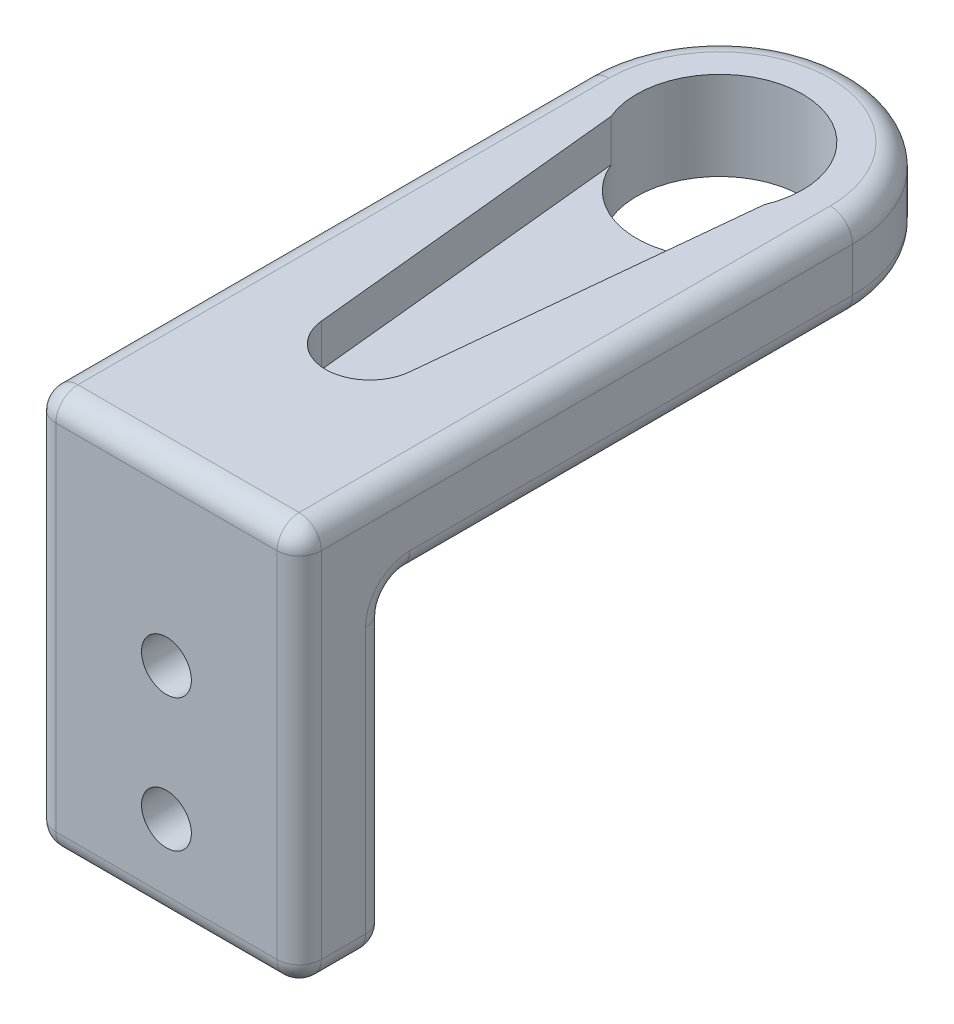
ISO-10303-21;
HEADER;
FILE_DESCRIPTION(('STEP AP214'),'2;1');
FILE_NAME('part.step','',(''),(''),'','','');
FILE_SCHEMA(('AUTOMOTIVE_DESIGN { 1 0 10303 214 1 1 1 1 }'));
ENDSEC;
DATA;
#1=APPLICATION_CONTEXT('core data for automotive mechanical design processes');
#2=APPLICATION_PROTOCOL_DEFINITION('international standard','automotive_design',2000,#1);
#3=PRODUCT_CONTEXT('',#1,'mechanical');
#4=PRODUCT('Part','Part','',(#3));
#5=PRODUCT_RELATED_PRODUCT_CATEGORY('part','',(#4));
#6=PRODUCT_DEFINITION_FORMATION('','',#4);
#7=PRODUCT_DEFINITION_CONTEXT('part definition',#1,'design');
#8=PRODUCT_DEFINITION('design','',#6,#7);
#9=PRODUCT_DEFINITION_SHAPE('','',#8);
#10=(LENGTH_UNIT() NAMED_UNIT(*) SI_UNIT(.MILLI.,.METRE.));
#11=(NAMED_UNIT(*) PLANE_ANGLE_UNIT() SI_UNIT($,.RADIAN.));
#12=(NAMED_UNIT(*) SI_UNIT($,.STERADIAN.) SOLID_ANGLE_UNIT());
#13=UNCERTAINTY_MEASURE_WITH_UNIT(LENGTH_MEASURE(1.E-05),#10,'distance_accuracy_value','');
#14=(GEOMETRIC_REPRESENTATION_CONTEXT(3) GLOBAL_UNCERTAINTY_ASSIGNED_CONTEXT((#13)) GLOBAL_UNIT_ASSIGNED_CONTEXT((#10,
#11,#12)) REPRESENTATION_CONTEXT('',''));
#15=CARTESIAN_POINT('',(0.,0.,0.));
#16=DIRECTION('',(0.,0.,1.));
#17=DIRECTION('',(1.,0.,0.));
#18=AXIS2_PLACEMENT_3D('',#15,#16,#17);
#19=CARTESIAN_POINT('',(0.,4.,0.));
#20=DIRECTION('',(0.,-1.,0.));
#21=DIRECTION('',(0.,0.,-1.));
#22=AXIS2_PLACEMENT_3D('',#19,#20,#21);
#23=CYLINDRICAL_SURFACE('',#22,6.);
#24=DIRECTION('',(0.,-1.,0.));
#25=VECTOR('',#24,1.);
#26=CARTESIAN_POINT('',(-6.,4.,0.));
#27=LINE('',#26,#25);
#28=CARTESIAN_POINT('',(-6.,3.,0.));
#29=VERTEX_POINT('',#28);
#30=CARTESIAN_POINT('',(-6.,1.,0.));
#31=VERTEX_POINT('',#30);
#32=EDGE_CURVE('E234',#29,#31,#27,.T.);
#33=ORIENTED_EDGE('',*,*,#32,.F.);
#34=CARTESIAN_POINT('',(0.,3.,0.));
#35=DIRECTION('',(0.,-1.,0.));
#36=DIRECTION('',(0.,0.,-1.));
#37=AXIS2_PLACEMENT_3D('',#34,#35,#36);
#38=CIRCLE('',#37,6.);
#39=CARTESIAN_POINT('',(6.,3.,0.));
#40=VERTEX_POINT('',#39);
#41=EDGE_CURVE('E306',#29,#40,#38,.T.);
#42=ORIENTED_EDGE('',*,*,#41,.T.);
#43=DIRECTION('',(0.,-1.,0.));
#44=VECTOR('',#43,1.);
#45=CARTESIAN_POINT('',(6.,4.,0.));
#46=LINE('',#45,#44);
#47=CARTESIAN_POINT('',(6.,1.,0.));
#48=VERTEX_POINT('',#47);
#49=EDGE_CURVE('E225',#40,#48,#46,.T.);
#50=ORIENTED_EDGE('',*,*,#49,.T.);
#51=CARTESIAN_POINT('',(0.,1.,0.));
#52=DIRECTION('',(0.,-1.,0.));
#53=DIRECTION('',(0.,0.,-1.));
#54=AXIS2_PLACEMENT_3D('',#51,#52,#53);
#55=CIRCLE('',#54,6.);
#56=EDGE_CURVE('E303',#48,#31,#55,.F.);
#57=ORIENTED_EDGE('',*,*,#56,.T.);
#58=EDGE_LOOP('',(#33,#42,#50,#57));
#59=FACE_BOUND('',#58,.T.);
#60=ADVANCED_FACE('F43',(#59),#23,.T.);
#61=CARTESIAN_POINT('',(-6.,4.,0.));
#62=DIRECTION('',(1.,0.,0.));
#63=DIRECTION('',(0.,0.,-1.));
#64=AXIS2_PLACEMENT_3D('',#61,#62,#63);
#65=PLANE('',#64);
#66=DIRECTION('',(0.,-1.,0.));
#67=VECTOR('',#66,1.);
#68=CARTESIAN_POINT('',(-6.,4.,24.));
#69=LINE('',#68,#67);
#70=CARTESIAN_POINT('',(-6.,-13.,24.));
#71=VERTEX_POINT('',#70);
#72=CARTESIAN_POINT('',(-6.,3.,24.));
#73=VERTEX_POINT('',#72);
#74=EDGE_CURVE('E284',#71,#73,#69,.F.);
#75=ORIENTED_EDGE('',*,*,#74,.T.);
#76=DIRECTION('',(0.,0.,1.));
#77=VECTOR('',#76,1.);
#78=CARTESIAN_POINT('',(-6.,3.,0.));
#79=LINE('',#78,#77);
#80=EDGE_CURVE('E287',#73,#29,#79,.F.);
#81=ORIENTED_EDGE('',*,*,#80,.T.);
#82=ORIENTED_EDGE('',*,*,#32,.T.);
#83=DIRECTION('',(0.,0.,1.));
#84=VECTOR('',#83,1.);
#85=CARTESIAN_POINT('',(-6.,1.,21.));
#86=LINE('',#85,#84);
#87=CARTESIAN_POINT('',(-6.,1.,20.));
#88=VERTEX_POINT('',#87);
#89=EDGE_CURVE('E275',#31,#88,#86,.T.);
#90=ORIENTED_EDGE('',*,*,#89,.T.);
#91=CARTESIAN_POINT('',(-6.,-0.999999999999999,20.));
#92=DIRECTION('',(1.,0.,0.));
#93=DIRECTION('',(0.,0.,-1.));
#94=AXIS2_PLACEMENT_3D('',#91,#92,#93);
#95=CIRCLE('',#94,2.);
#96=CARTESIAN_POINT('',(-6.,-0.999999999999999,22.));
#97=VERTEX_POINT('',#96);
#98=EDGE_CURVE('E271',#97,#88,#95,.F.);
#99=ORIENTED_EDGE('',*,*,#98,.F.);
#100=DIRECTION('',(0.,1.,0.));
#101=VECTOR('',#100,1.);
#102=CARTESIAN_POINT('',(-6.,4.,22.));
#103=LINE('',#102,#101);
#104=CARTESIAN_POINT('',(-6.,-13.,22.));
#105=VERTEX_POINT('',#104);
#106=EDGE_CURVE('E278',#97,#105,#103,.F.);
#107=ORIENTED_EDGE('',*,*,#106,.T.);
#108=DIRECTION('',(0.,0.,-1.));
#109=VECTOR('',#108,1.);
#110=CARTESIAN_POINT('',(-6.,-13.,25.));
#111=LINE('',#110,#109);
#112=EDGE_CURVE('E281',#105,#71,#111,.F.);
#113=ORIENTED_EDGE('',*,*,#112,.T.);
#114=EDGE_LOOP('',(#75,#81,#82,#90,#99,#107,#113));
#115=FACE_BOUND('',#114,.T.);
#116=ADVANCED_FACE('F507',(#115),#65,.F.);
#117=CARTESIAN_POINT('',(-6.,4.,25.));
#118=DIRECTION('',(0.,0.,-1.));
#119=DIRECTION('',(-1.,0.,0.));
#120=AXIS2_PLACEMENT_3D('',#117,#118,#119);
#121=PLANE('',#120);
#122=DIRECTION('',(0.,-1.,0.));
#123=VECTOR('',#122,1.);
#124=CARTESIAN_POINT('',(5.,4.,25.));
#125=LINE('',#124,#123);
#126=CARTESIAN_POINT('',(5.,-13.,25.));
#127=VERTEX_POINT('',#126);
#128=CARTESIAN_POINT('',(5.,3.,25.));
#129=VERTEX_POINT('',#128);
#130=EDGE_CURVE('E328',#127,#129,#125,.F.);
#131=ORIENTED_EDGE('',*,*,#130,.T.);
#132=DIRECTION('',(1.,0.,0.));
#133=VECTOR('',#132,1.);
#134=CARTESIAN_POINT('',(-6.,3.,25.));
#135=LINE('',#134,#133);
#136=CARTESIAN_POINT('',(-5.,3.,25.));
#137=VERTEX_POINT('',#136);
#138=EDGE_CURVE('E331',#129,#137,#135,.F.);
#139=ORIENTED_EDGE('',*,*,#138,.T.);
#140=DIRECTION('',(0.,-1.,0.));
#141=VECTOR('',#140,1.);
#142=CARTESIAN_POINT('',(-5.,4.,25.));
#143=LINE('',#142,#141);
#144=CARTESIAN_POINT('',(-5.,-13.,25.));
#145=VERTEX_POINT('',#144);
#146=EDGE_CURVE('E325',#137,#145,#143,.T.);
#147=ORIENTED_EDGE('',*,*,#146,.T.);
#148=DIRECTION('',(-1.,0.,0.));
#149=VECTOR('',#148,1.);
#150=CARTESIAN_POINT('',(6.,-13.,25.));
#151=LINE('',#150,#149);
#152=EDGE_CURVE('E322',#145,#127,#151,.F.);
#153=ORIENTED_EDGE('',*,*,#152,.T.);
#154=EDGE_LOOP('',(#131,#139,#147,#153));
#155=FACE_BOUND('',#154,.T.);
#156=CARTESIAN_POINT('',(0.,-10.,25.));
#157=DIRECTION('',(0.,0.,-1.));
#158=DIRECTION('',(-1.,0.,0.));
#159=AXIS2_PLACEMENT_3D('',#156,#157,#158);
#160=CIRCLE('',#159,1.125);
#161=CARTESIAN_POINT('',(-1.125,-10.,25.));
#162=VERTEX_POINT('',#161);
#163=EDGE_CURVE('E466',#162,#162,#160,.F.);
#164=ORIENTED_EDGE('',*,*,#163,.F.);
#165=EDGE_LOOP('',(#164));
#166=FACE_BOUND('',#165,.T.);
#167=CARTESIAN_POINT('',(0.,-4.,25.));
#168=DIRECTION('',(0.,0.,-1.));
#169=DIRECTION('',(-1.,0.,0.));
#170=AXIS2_PLACEMENT_3D('',#167,#168,#169);
#171=CIRCLE('',#170,1.125);
#172=CARTESIAN_POINT('',(-1.125,-4.,25.));
#173=VERTEX_POINT('',#172);
#174=EDGE_CURVE('E450',#173,#173,#171,.F.);
#175=ORIENTED_EDGE('',*,*,#174,.F.);
#176=EDGE_LOOP('',(#175));
#177=FACE_BOUND('',#176,.T.);
#178=ADVANCED_FACE('F502',(#155,#166,#177),#121,.F.);
#179=CARTESIAN_POINT('',(6.,4.,25.));
#180=DIRECTION('',(-1.,0.,0.));
#181=DIRECTION('',(0.,0.,1.));
#182=AXIS2_PLACEMENT_3D('',#179,#180,#181);
#183=PLANE('',#182);
#184=CARTESIAN_POINT('',(6.,-0.999999999999999,20.));
#185=DIRECTION('',(-1.,0.,0.));
#186=DIRECTION('',(0.,0.,1.));
#187=AXIS2_PLACEMENT_3D('',#184,#185,#186);
#188=CIRCLE('',#187,2.);
#189=CARTESIAN_POINT('',(6.,1.,20.));
#190=VERTEX_POINT('',#189);
#191=CARTESIAN_POINT('',(6.,-0.999999999999999,22.));
#192=VERTEX_POINT('',#191);
#193=EDGE_CURVE('E251',#190,#192,#188,.F.);
#194=ORIENTED_EDGE('',*,*,#193,.F.);
#195=DIRECTION('',(0.,0.,-1.));
#196=VECTOR('',#195,1.);
#197=CARTESIAN_POINT('',(6.,1.,0.));
#198=LINE('',#197,#196);
#199=EDGE_CURVE('E255',#190,#48,#198,.T.);
#200=ORIENTED_EDGE('',*,*,#199,.T.);
#201=ORIENTED_EDGE('',*,*,#49,.F.);
#202=DIRECTION('',(0.,0.,-1.));
#203=VECTOR('',#202,1.);
#204=CARTESIAN_POINT('',(6.,3.,25.));
#205=LINE('',#204,#203);
#206=CARTESIAN_POINT('',(6.,3.,24.));
#207=VERTEX_POINT('',#206);
#208=EDGE_CURVE('E244',#40,#207,#205,.F.);
#209=ORIENTED_EDGE('',*,*,#208,.T.);
#210=DIRECTION('',(0.,-1.,0.));
#211=VECTOR('',#210,1.);
#212=CARTESIAN_POINT('',(6.,4.,24.));
#213=LINE('',#212,#211);
#214=CARTESIAN_POINT('',(6.,-13.,24.));
#215=VERTEX_POINT('',#214);
#216=EDGE_CURVE('E241',#207,#215,#213,.T.);
#217=ORIENTED_EDGE('',*,*,#216,.T.);
#218=DIRECTION('',(0.,0.,1.));
#219=VECTOR('',#218,1.);
#220=CARTESIAN_POINT('',(6.,-13.,21.));
#221=LINE('',#220,#219);
#222=CARTESIAN_POINT('',(6.,-13.,22.));
#223=VERTEX_POINT('',#222);
#224=EDGE_CURVE('E238',#215,#223,#221,.F.);
#225=ORIENTED_EDGE('',*,*,#224,.T.);
#226=DIRECTION('',(0.,1.,0.));
#227=VECTOR('',#226,1.);
#228=CARTESIAN_POINT('',(6.,4.,22.));
#229=LINE('',#228,#227);
#230=EDGE_CURVE('E247',#223,#192,#229,.T.);
#231=ORIENTED_EDGE('',*,*,#230,.T.);
#232=EDGE_LOOP('',(#194,#200,#201,#209,#217,#225,#231));
#233=FACE_BOUND('',#232,.T.);
#234=ADVANCED_FACE('F492',(#233),#183,.F.);
#235=CARTESIAN_POINT('',(0.,4.,0.));
#236=DIRECTION('',(0.,-1.,0.));
#237=DIRECTION('',(0.,0.,-1.));
#238=AXIS2_PLACEMENT_3D('',#235,#236,#237);
#239=PLANE('',#238);
#240=DIRECTION('',(1.,0.,0.));
#241=VECTOR('',#240,1.);
#242=CARTESIAN_POINT('',(0.,4.,24.));
#243=LINE('',#242,#241);
#244=CARTESIAN_POINT('',(-5.,4.,24.));
#245=VERTEX_POINT('',#244);
#246=CARTESIAN_POINT('',(5.,4.,24.));
#247=VERTEX_POINT('',#246);
#248=EDGE_CURVE('E293',#245,#247,#243,.T.);
#249=ORIENTED_EDGE('',*,*,#248,.T.);
#250=DIRECTION('',(0.,0.,-1.));
#251=VECTOR('',#250,1.);
#252=CARTESIAN_POINT('',(5.,4.,0.));
#253=LINE('',#252,#251);
#254=CARTESIAN_POINT('',(5.,4.,0.));
#255=VERTEX_POINT('',#254);
#256=EDGE_CURVE('E299',#247,#255,#253,.T.);
#257=ORIENTED_EDGE('',*,*,#256,.T.);
#258=CARTESIAN_POINT('',(0.,4.,0.));
#259=DIRECTION('',(0.,-1.,0.));
#260=DIRECTION('',(0.,0.,-1.));
#261=AXIS2_PLACEMENT_3D('',#258,#259,#260);
#262=CIRCLE('',#261,5.);
#263=CARTESIAN_POINT('',(-5.,4.,0.));
#264=VERTEX_POINT('',#263);
#265=EDGE_CURVE('E296',#255,#264,#262,.F.);
#266=ORIENTED_EDGE('',*,*,#265,.T.);
#267=DIRECTION('',(0.,0.,1.));
#268=VECTOR('',#267,1.);
#269=CARTESIAN_POINT('',(-5.,4.,0.));
#270=LINE('',#269,#268);
#271=EDGE_CURVE('E290',#264,#245,#270,.T.);
#272=ORIENTED_EDGE('',*,*,#271,.T.);
#273=EDGE_LOOP('',(#249,#257,#266,#272));
#274=FACE_BOUND('',#273,.T.);
#275=CARTESIAN_POINT('',(0.,4.,0.));
#276=DIRECTION('',(0.,1.,0.));
#277=DIRECTION('',(0.,0.,1.));
#278=AXIS2_PLACEMENT_3D('',#275,#276,#277);
#279=CIRCLE('',#278,3.75);
#280=CARTESIAN_POINT('',(3.45999999999994,4.,1.4459944674861));
#281=VERTEX_POINT('',#280);
#282=CARTESIAN_POINT('',(-3.46,4.,1.44599446748596));
#283=VERTEX_POINT('',#282);
#284=EDGE_CURVE('E213',#281,#283,#279,.T.);
#285=ORIENTED_EDGE('',*,*,#284,.F.);
#286=DIRECTION('',(0.1004588297189,0.,-0.994941216118575));
#287=VECTOR('',#286,1.);
#288=CARTESIAN_POINT('',(3.45999999999994,4.,1.4459944674861));
#289=LINE('',#288,#287);
#290=CARTESIAN_POINT('',(1.98988243223717,4.,16.0059944674861));
#291=VERTEX_POINT('',#290);
#292=EDGE_CURVE('E208',#291,#281,#289,.T.);
#293=ORIENTED_EDGE('',*,*,#292,.F.);
#294=CARTESIAN_POINT('',(0.,4.,15.8050768080483));
#295=DIRECTION('',(0.,1.,0.));
#296=DIRECTION('',(0.,0.,1.));
#297=AXIS2_PLACEMENT_3D('',#294,#295,#296);
#298=CIRCLE('',#297,2.00000000000002);
#299=CARTESIAN_POINT('',(-1.98988243223721,4.,16.005994467486));
#300=VERTEX_POINT('',#299);
#301=EDGE_CURVE('E474',#300,#291,#298,.T.);
#302=ORIENTED_EDGE('',*,*,#301,.F.);
#303=DIRECTION('',(0.100458829718901,0.,0.994941216118575));
#304=VECTOR('',#303,1.);
#305=CARTESIAN_POINT('',(-3.46,4.,1.44599446748596));
#306=LINE('',#305,#304);
#307=EDGE_CURVE('E471',#283,#300,#306,.T.);
#308=ORIENTED_EDGE('',*,*,#307,.F.);
#309=EDGE_LOOP('',(#285,#293,#302,#308));
#310=FACE_BOUND('',#309,.T.);
#311=ADVANCED_FACE('F489',(#274,#310),#239,.F.);
#312=CARTESIAN_POINT('',(0.,0.,0.));
#313=DIRECTION('',(0.,-1.,0.));
#314=DIRECTION('',(0.,0.,-1.));
#315=AXIS2_PLACEMENT_3D('',#312,#313,#314);
#316=PLANE('',#315);
#317=CARTESIAN_POINT('',(0.,0.,0.));
#318=DIRECTION('',(0.,-1.,0.));
#319=DIRECTION('',(0.,0.,-1.));
#320=AXIS2_PLACEMENT_3D('',#317,#318,#319);
#321=CIRCLE('',#320,5.);
#322=CARTESIAN_POINT('',(-5.,0.,0.));
#323=VERTEX_POINT('',#322);
#324=CARTESIAN_POINT('',(5.,0.,0.));
#325=VERTEX_POINT('',#324);
#326=EDGE_CURVE('E315',#323,#325,#321,.T.);
#327=ORIENTED_EDGE('',*,*,#326,.T.);
#328=DIRECTION('',(0.,0.,-1.));
#329=VECTOR('',#328,1.);
#330=CARTESIAN_POINT('',(5.,0.,21.));
#331=LINE('',#330,#329);
#332=CARTESIAN_POINT('',(5.,0.,20.));
#333=VERTEX_POINT('',#332);
#334=EDGE_CURVE('E318',#325,#333,#331,.F.);
#335=ORIENTED_EDGE('',*,*,#334,.T.);
#336=DIRECTION('',(1.,0.,0.));
#337=VECTOR('',#336,1.);
#338=CARTESIAN_POINT('',(0.,0.,20.));
#339=LINE('',#338,#337);
#340=CARTESIAN_POINT('',(-5.,0.,20.));
#341=VERTEX_POINT('',#340);
#342=EDGE_CURVE('E309',#333,#341,#339,.F.);
#343=ORIENTED_EDGE('',*,*,#342,.T.);
#344=DIRECTION('',(0.,0.,1.));
#345=VECTOR('',#344,1.);
#346=CARTESIAN_POINT('',(-5.,0.,0.));
#347=LINE('',#346,#345);
#348=EDGE_CURVE('E312',#341,#323,#347,.F.);
#349=ORIENTED_EDGE('',*,*,#348,.T.);
#350=EDGE_LOOP('',(#327,#335,#343,#349));
#351=FACE_BOUND('',#350,.T.);
#352=CARTESIAN_POINT('',(0.,0.,0.));
#353=DIRECTION('',(0.,-1.,0.));
#354=DIRECTION('',(0.,0.,-1.));
#355=AXIS2_PLACEMENT_3D('',#352,#353,#354);
#356=CIRCLE('',#355,3.75);
#357=CARTESIAN_POINT('',(0.,0.,-3.75));
#358=VERTEX_POINT('',#357);
#359=EDGE_CURVE('E226',#358,#358,#356,.F.);
#360=ORIENTED_EDGE('',*,*,#359,.T.);
#361=EDGE_LOOP('',(#360));
#362=FACE_BOUND('',#361,.T.);
#363=ADVANCED_FACE('F491',(#351,#362),#316,.T.);
#364=CARTESIAN_POINT('',(0.,-0.00100000000000013,0.));
#365=DIRECTION('',(0.,1.,0.));
#366=DIRECTION('',(0.,0.,1.));
#367=AXIS2_PLACEMENT_3D('',#364,#365,#366);
#368=CYLINDRICAL_SURFACE('',#367,3.75);
#369=ORIENTED_EDGE('',*,*,#359,.F.);
#370=EDGE_LOOP('',(#369));
#371=FACE_BOUND('',#370,.T.);
#372=CARTESIAN_POINT('',(0.,2.1,0.));
#373=DIRECTION('',(0.,-1.,0.));
#374=DIRECTION('',(0.,0.,1.));
#375=AXIS2_PLACEMENT_3D('',#372,#373,#374);
#376=CIRCLE('',#375,3.75);
#377=CARTESIAN_POINT('',(3.45999999999994,2.1,1.4459944674861));
#378=VERTEX_POINT('',#377);
#379=CARTESIAN_POINT('',(-3.46,2.1,1.44599446748596));
#380=VERTEX_POINT('',#379);
#381=EDGE_CURVE('E198',#378,#380,#376,.T.);
#382=ORIENTED_EDGE('',*,*,#381,.F.);
#383=DIRECTION('',(0.,1.,0.));
#384=VECTOR('',#383,1.);
#385=CARTESIAN_POINT('',(3.45999999999994,2.1,1.4459944674861));
#386=LINE('',#385,#384);
#387=EDGE_CURVE('E230',#378,#281,#386,.T.);
#388=ORIENTED_EDGE('',*,*,#387,.T.);
#389=ORIENTED_EDGE('',*,*,#284,.T.);
#390=DIRECTION('',(0.,1.,0.));
#391=VECTOR('',#390,1.);
#392=CARTESIAN_POINT('',(-3.46,2.1,1.44599446748596));
#393=LINE('',#392,#391);
#394=EDGE_CURVE('E190',#380,#283,#393,.T.);
#395=ORIENTED_EDGE('',*,*,#394,.F.);
#396=EDGE_LOOP('',(#382,#388,#389,#395));
#397=FACE_BOUND('',#396,.T.);
#398=ADVANCED_FACE('F211',(#371,#397),#368,.F.);
#399=CARTESIAN_POINT('',(3.45999999999994,2.1,1.4459944674861));
#400=DIRECTION('',(0.994941216118575,0.,0.1004588297189));
#401=DIRECTION('',(0.1004588297189,0.,-0.994941216118575));
#402=AXIS2_PLACEMENT_3D('',#399,#400,#401);
#403=PLANE('',#402);
#404=ORIENTED_EDGE('',*,*,#292,.T.);
#405=ORIENTED_EDGE('',*,*,#387,.F.);
#406=DIRECTION('',(0.1004588297189,0.,-0.994941216118575));
#407=VECTOR('',#406,1.);
#408=CARTESIAN_POINT('',(3.45999999999994,2.1,1.4459944674861));
#409=LINE('',#408,#407);
#410=CARTESIAN_POINT('',(1.98988243223717,2.1,16.0059944674861));
#411=VERTEX_POINT('',#410);
#412=EDGE_CURVE('E203',#411,#378,#409,.T.);
#413=ORIENTED_EDGE('',*,*,#412,.F.);
#414=DIRECTION('',(0.,1.,0.));
#415=VECTOR('',#414,1.);
#416=CARTESIAN_POINT('',(1.98988243223717,2.1,16.0059944674861));
#417=LINE('',#416,#415);
#418=EDGE_CURVE('E218',#411,#291,#417,.T.);
#419=ORIENTED_EDGE('',*,*,#418,.T.);
#420=EDGE_LOOP('',(#404,#405,#413,#419));
#421=FACE_BOUND('',#420,.T.);
#422=ADVANCED_FACE('F483',(#421),#403,.F.);
#423=CARTESIAN_POINT('',(0.,2.1,15.8050768080483));
#424=DIRECTION('',(0.,1.,0.));
#425=DIRECTION('',(0.,0.,1.));
#426=AXIS2_PLACEMENT_3D('',#423,#424,#425);
#427=CYLINDRICAL_SURFACE('',#426,2.00000000000002);
#428=ORIENTED_EDGE('',*,*,#301,.T.);
#429=ORIENTED_EDGE('',*,*,#418,.F.);
#430=CARTESIAN_POINT('',(0.,2.1,15.8050768080483));
#431=DIRECTION('',(0.,1.,0.));
#432=DIRECTION('',(0.,0.,1.));
#433=AXIS2_PLACEMENT_3D('',#430,#431,#432);
#434=CIRCLE('',#433,2.00000000000002);
#435=CARTESIAN_POINT('',(-1.98988243223721,2.1,16.005994467486));
#436=VERTEX_POINT('',#435);
#437=EDGE_CURVE('E197',#436,#411,#434,.T.);
#438=ORIENTED_EDGE('',*,*,#437,.F.);
#439=DIRECTION('',(0.,1.,0.));
#440=VECTOR('',#439,1.);
#441=CARTESIAN_POINT('',(-1.98988243223721,2.1,16.005994467486));
#442=LINE('',#441,#440);
#443=EDGE_CURVE('E192',#436,#300,#442,.T.);
#444=ORIENTED_EDGE('',*,*,#443,.T.);
#445=EDGE_LOOP('',(#428,#429,#438,#444));
#446=FACE_BOUND('',#445,.T.);
#447=ADVANCED_FACE('F487',(#446),#427,.F.);
#448=CARTESIAN_POINT('',(-3.46,2.1,1.44599446748596));
#449=DIRECTION('',(-0.994941216118575,0.,0.100458829718901));
#450=DIRECTION('',(0.100458829718901,0.,0.994941216118575));
#451=AXIS2_PLACEMENT_3D('',#448,#449,#450);
#452=PLANE('',#451);
#453=ORIENTED_EDGE('',*,*,#307,.T.);
#454=ORIENTED_EDGE('',*,*,#443,.F.);
#455=DIRECTION('',(0.100458829718901,0.,0.994941216118575));
#456=VECTOR('',#455,1.);
#457=CARTESIAN_POINT('',(-3.46,2.1,1.44599446748596));
#458=LINE('',#457,#456);
#459=EDGE_CURVE('E185',#380,#436,#458,.T.);
#460=ORIENTED_EDGE('',*,*,#459,.F.);
#461=ORIENTED_EDGE('',*,*,#394,.T.);
#462=EDGE_LOOP('',(#453,#454,#460,#461));
#463=FACE_BOUND('',#462,.T.);
#464=ADVANCED_FACE('F188',(#463),#452,.F.);
#465=CARTESIAN_POINT('',(0.,2.1,0.));
#466=DIRECTION('',(0.,1.,0.));
#467=DIRECTION('',(0.,0.,1.));
#468=AXIS2_PLACEMENT_3D('',#465,#466,#467);
#469=PLANE('',#468);
#470=ORIENTED_EDGE('',*,*,#381,.T.);
#471=ORIENTED_EDGE('',*,*,#459,.T.);
#472=ORIENTED_EDGE('',*,*,#437,.T.);
#473=ORIENTED_EDGE('',*,*,#412,.T.);
#474=EDGE_LOOP('',(#470,#471,#472,#473));
#475=FACE_BOUND('',#474,.T.);
#476=ADVANCED_FACE('F201',(#475),#469,.T.);
#477=CARTESIAN_POINT('',(-5.99999999999999,-14.,21.));
#478=DIRECTION('',(0.,0.,1.));
#479=DIRECTION('',(1.,0.,0.));
#480=AXIS2_PLACEMENT_3D('',#477,#478,#479);
#481=PLANE('',#480);
#482=DIRECTION('',(0.,1.,0.));
#483=VECTOR('',#482,1.);
#484=CARTESIAN_POINT('',(5.,-14.,21.));
#485=LINE('',#484,#483);
#486=CARTESIAN_POINT('',(5.,-0.999999999999999,21.));
#487=VERTEX_POINT('',#486);
#488=CARTESIAN_POINT('',(5.,-13.,21.));
#489=VERTEX_POINT('',#488);
#490=EDGE_CURVE('E264',#487,#489,#485,.F.);
#491=ORIENTED_EDGE('',*,*,#490,.T.);
#492=DIRECTION('',(1.,0.,0.));
#493=VECTOR('',#492,1.);
#494=CARTESIAN_POINT('',(-5.99999999999999,-13.,21.));
#495=LINE('',#494,#493);
#496=CARTESIAN_POINT('',(-5.,-13.,21.));
#497=VERTEX_POINT('',#496);
#498=EDGE_CURVE('E268',#489,#497,#495,.F.);
#499=ORIENTED_EDGE('',*,*,#498,.T.);
#500=DIRECTION('',(0.,1.,0.));
#501=VECTOR('',#500,1.);
#502=CARTESIAN_POINT('',(-5.,-14.,21.));
#503=LINE('',#502,#501);
#504=CARTESIAN_POINT('',(-5.,-0.999999999999999,21.));
#505=VERTEX_POINT('',#504);
#506=EDGE_CURVE('E261',#497,#505,#503,.T.);
#507=ORIENTED_EDGE('',*,*,#506,.T.);
#508=DIRECTION('',(1.,0.,0.));
#509=VECTOR('',#508,1.);
#510=CARTESIAN_POINT('',(-5.99999999999999,-0.999999999999999,21.));
#511=LINE('',#510,#509);
#512=EDGE_CURVE('E258',#505,#487,#511,.T.);
#513=ORIENTED_EDGE('',*,*,#512,.T.);
#514=EDGE_LOOP('',(#491,#499,#507,#513));
#515=FACE_BOUND('',#514,.T.);
#516=CARTESIAN_POINT('',(0.,-10.,21.));
#517=DIRECTION('',(0.,0.,-1.));
#518=DIRECTION('',(-1.,0.,0.));
#519=AXIS2_PLACEMENT_3D('',#516,#517,#518);
#520=CIRCLE('',#519,1.125);
#521=CARTESIAN_POINT('',(-1.125,-10.,21.));
#522=VERTEX_POINT('',#521);
#523=EDGE_CURVE('E463',#522,#522,#520,.T.);
#524=ORIENTED_EDGE('',*,*,#523,.F.);
#525=EDGE_LOOP('',(#524));
#526=FACE_BOUND('',#525,.T.);
#527=CARTESIAN_POINT('',(0.,-4.,21.));
#528=DIRECTION('',(0.,0.,-1.));
#529=DIRECTION('',(-1.,0.,0.));
#530=AXIS2_PLACEMENT_3D('',#527,#528,#529);
#531=CIRCLE('',#530,1.125);
#532=CARTESIAN_POINT('',(-1.125,-4.,21.));
#533=VERTEX_POINT('',#532);
#534=EDGE_CURVE('E457',#533,#533,#531,.T.);
#535=ORIENTED_EDGE('',*,*,#534,.F.);
#536=EDGE_LOOP('',(#535));
#537=FACE_BOUND('',#536,.T.);
#538=ADVANCED_FACE('F647',(#515,#526,#537),#481,.F.);
#539=CARTESIAN_POINT('',(0.,-14.,0.));
#540=DIRECTION('',(0.,-1.,0.));
#541=DIRECTION('',(0.,0.,-1.));
#542=AXIS2_PLACEMENT_3D('',#539,#540,#541);
#543=PLANE('',#542);
#544=DIRECTION('',(0.,0.,1.));
#545=VECTOR('',#544,1.);
#546=CARTESIAN_POINT('',(5.,-14.,25.));
#547=LINE('',#546,#545);
#548=CARTESIAN_POINT('',(5.,-14.,22.));
#549=VERTEX_POINT('',#548);
#550=CARTESIAN_POINT('',(5.,-14.,24.));
#551=VERTEX_POINT('',#550);
#552=EDGE_CURVE('E53',#549,#551,#547,.T.);
#553=ORIENTED_EDGE('',*,*,#552,.T.);
#554=DIRECTION('',(-1.,0.,0.));
#555=VECTOR('',#554,1.);
#556=CARTESIAN_POINT('',(-6.,-14.,24.));
#557=LINE('',#556,#555);
#558=CARTESIAN_POINT('',(-5.,-14.,24.));
#559=VERTEX_POINT('',#558);
#560=EDGE_CURVE('E11',#551,#559,#557,.T.);
#561=ORIENTED_EDGE('',*,*,#560,.T.);
#562=DIRECTION('',(0.,0.,-1.));
#563=VECTOR('',#562,1.);
#564=CARTESIAN_POINT('',(-5.,-14.,21.));
#565=LINE('',#564,#563);
#566=CARTESIAN_POINT('',(-5.,-14.,22.));
#567=VERTEX_POINT('',#566);
#568=EDGE_CURVE('E335',#559,#567,#565,.T.);
#569=ORIENTED_EDGE('',*,*,#568,.T.);
#570=DIRECTION('',(1.,0.,0.));
#571=VECTOR('',#570,1.);
#572=CARTESIAN_POINT('',(6.,-14.,22.));
#573=LINE('',#572,#571);
#574=EDGE_CURVE('E64',#567,#549,#573,.T.);
#575=ORIENTED_EDGE('',*,*,#574,.T.);
#576=EDGE_LOOP('',(#553,#561,#569,#575));
#577=FACE_BOUND('',#576,.T.);
#578=ADVANCED_FACE('F662',(#577),#543,.T.);
#579=CARTESIAN_POINT('',(0.,-4.,25.001));
#580=DIRECTION('',(0.,0.,-1.));
#581=DIRECTION('',(-1.,0.,0.));
#582=AXIS2_PLACEMENT_3D('',#579,#580,#581);
#583=CYLINDRICAL_SURFACE('',#582,1.125);
#584=ORIENTED_EDGE('',*,*,#534,.T.);
#585=EDGE_LOOP('',(#584));
#586=FACE_BOUND('',#585,.T.);
#587=ORIENTED_EDGE('',*,*,#174,.T.);
#588=EDGE_LOOP('',(#587));
#589=FACE_BOUND('',#588,.T.);
#590=ADVANCED_FACE('F685',(#586,#589),#583,.F.);
#591=CARTESIAN_POINT('',(0.,-10.,25.001));
#592=DIRECTION('',(0.,0.,-1.));
#593=DIRECTION('',(-1.,0.,0.));
#594=AXIS2_PLACEMENT_3D('',#591,#592,#593);
#595=CYLINDRICAL_SURFACE('',#594,1.125);
#596=ORIENTED_EDGE('',*,*,#523,.T.);
#597=EDGE_LOOP('',(#596));
#598=FACE_BOUND('',#597,.T.);
#599=ORIENTED_EDGE('',*,*,#163,.T.);
#600=EDGE_LOOP('',(#599));
#601=FACE_BOUND('',#600,.T.);
#602=ADVANCED_FACE('F611',(#598,#601),#595,.F.);
#603=CARTESIAN_POINT('',(-5.,3.,0.));
#604=DIRECTION('',(0.,0.,1.));
#605=DIRECTION('',(1.,0.,0.));
#606=AXIS2_PLACEMENT_3D('',#603,#604,#605);
#607=CYLINDRICAL_SURFACE('',#606,1.);
#608=CARTESIAN_POINT('',(-5.,3.,24.));
#609=DIRECTION('',(0.,0.,1.));
#610=DIRECTION('',(1.,0.,0.));
#611=AXIS2_PLACEMENT_3D('',#608,#609,#610);
#612=CIRCLE('',#611,1.);
#613=EDGE_CURVE('E47',#245,#73,#612,.T.);
#614=ORIENTED_EDGE('',*,*,#613,.F.);
#615=ORIENTED_EDGE('',*,*,#271,.F.);
#616=CARTESIAN_POINT('',(-5.,3.,0.));
#617=DIRECTION('',(0.,0.,-1.));
#618=DIRECTION('',(-1.,0.,0.));
#619=AXIS2_PLACEMENT_3D('',#616,#617,#618);
#620=CIRCLE('',#619,1.);
#621=EDGE_CURVE('E441',#29,#264,#620,.T.);
#622=ORIENTED_EDGE('',*,*,#621,.F.);
#623=ORIENTED_EDGE('',*,*,#80,.F.);
#624=EDGE_LOOP('',(#614,#615,#622,#623));
#625=FACE_BOUND('',#624,.T.);
#626=ADVANCED_FACE('F45',(#625),#607,.T.);
#627=CARTESIAN_POINT('',(-5.,3.,24.));
#628=DIRECTION('',(-1.,0.,0.));
#629=DIRECTION('',(0.,0.,1.));
#630=AXIS2_PLACEMENT_3D('',#627,#628,#629);
#631=SPHERICAL_SURFACE('',#630,1.);
#632=CARTESIAN_POINT('',(-5.,3.,24.));
#633=DIRECTION('',(-1.,0.,0.));
#634=DIRECTION('',(0.,0.,1.));
#635=AXIS2_PLACEMENT_3D('',#632,#633,#634);
#636=CIRCLE('',#635,1.);
#637=EDGE_CURVE('E434',#245,#137,#636,.F.);
#638=ORIENTED_EDGE('',*,*,#637,.F.);
#639=ORIENTED_EDGE('',*,*,#613,.T.);
#640=CARTESIAN_POINT('',(-5.,3.,24.));
#641=DIRECTION('',(0.,1.,0.));
#642=DIRECTION('',(0.,0.,1.));
#643=AXIS2_PLACEMENT_3D('',#640,#641,#642);
#644=CIRCLE('',#643,1.);
#645=EDGE_CURVE('E438',#137,#73,#644,.F.);
#646=ORIENTED_EDGE('',*,*,#645,.F.);
#647=EDGE_LOOP('',(#638,#639,#646));
#648=FACE_BOUND('',#647,.T.);
#649=ADVANCED_FACE('F606',(#648),#631,.T.);
#650=CARTESIAN_POINT('',(0.,3.,0.));
#651=DIRECTION('',(0.,-1.,0.));
#652=DIRECTION('',(0.,0.,-1.));
#653=AXIS2_PLACEMENT_3D('',#650,#651,#652);
#654=TOROIDAL_SURFACE('',#653,5.,1.);
#655=ORIENTED_EDGE('',*,*,#621,.T.);
#656=ORIENTED_EDGE('',*,*,#265,.F.);
#657=CARTESIAN_POINT('',(5.,3.,0.));
#658=DIRECTION('',(0.,0.,1.));
#659=DIRECTION('',(0.,-1.,0.));
#660=AXIS2_PLACEMENT_3D('',#657,#658,#659);
#661=CIRCLE('',#660,1.);
#662=EDGE_CURVE('E431',#40,#255,#661,.T.);
#663=ORIENTED_EDGE('',*,*,#662,.F.);
#664=ORIENTED_EDGE('',*,*,#41,.F.);
#665=EDGE_LOOP('',(#655,#656,#663,#664));
#666=FACE_BOUND('',#665,.T.);
#667=ADVANCED_FACE('F603',(#666),#654,.T.);
#668=CARTESIAN_POINT('',(-5.,4.,24.));
#669=DIRECTION('',(0.,-1.,0.));
#670=DIRECTION('',(0.,0.,-1.));
#671=AXIS2_PLACEMENT_3D('',#668,#669,#670);
#672=CYLINDRICAL_SURFACE('',#671,1.);
#673=ORIENTED_EDGE('',*,*,#645,.T.);
#674=ORIENTED_EDGE('',*,*,#74,.F.);
#675=CARTESIAN_POINT('',(-5.,-13.,24.));
#676=DIRECTION('',(0.,-1.,0.));
#677=DIRECTION('',(0.,0.,-1.));
#678=AXIS2_PLACEMENT_3D('',#675,#676,#677);
#679=CIRCLE('',#678,1.);
#680=EDGE_CURVE('E427',#145,#71,#679,.T.);
#681=ORIENTED_EDGE('',*,*,#680,.F.);
#682=ORIENTED_EDGE('',*,*,#146,.F.);
#683=EDGE_LOOP('',(#673,#674,#681,#682));
#684=FACE_BOUND('',#683,.T.);
#685=ADVANCED_FACE('F599',(#684),#672,.T.);
#686=CARTESIAN_POINT('',(0.,3.,24.));
#687=DIRECTION('',(1.,0.,0.));
#688=DIRECTION('',(0.,0.,-1.));
#689=AXIS2_PLACEMENT_3D('',#686,#687,#688);
#690=CYLINDRICAL_SURFACE('',#689,1.);
#691=ORIENTED_EDGE('',*,*,#637,.T.);
#692=ORIENTED_EDGE('',*,*,#138,.F.);
#693=CARTESIAN_POINT('',(5.,3.,24.));
#694=DIRECTION('',(1.,0.,0.));
#695=DIRECTION('',(0.,0.,-1.));
#696=AXIS2_PLACEMENT_3D('',#693,#694,#695);
#697=CIRCLE('',#696,1.);
#698=EDGE_CURVE('E423',#247,#129,#697,.T.);
#699=ORIENTED_EDGE('',*,*,#698,.F.);
#700=ORIENTED_EDGE('',*,*,#248,.F.);
#701=EDGE_LOOP('',(#691,#692,#699,#700));
#702=FACE_BOUND('',#701,.T.);
#703=ADVANCED_FACE('F595',(#702),#690,.T.);
#704=CARTESIAN_POINT('',(5.,3.,0.));
#705=DIRECTION('',(0.,0.,-1.));
#706=DIRECTION('',(-1.,0.,0.));
#707=AXIS2_PLACEMENT_3D('',#704,#705,#706);
#708=CYLINDRICAL_SURFACE('',#707,1.);
#709=ORIENTED_EDGE('',*,*,#662,.T.);
#710=ORIENTED_EDGE('',*,*,#256,.F.);
#711=CARTESIAN_POINT('',(5.,3.,24.));
#712=DIRECTION('',(0.,0.,1.));
#713=DIRECTION('',(1.,0.,0.));
#714=AXIS2_PLACEMENT_3D('',#711,#712,#713);
#715=CIRCLE('',#714,1.);
#716=EDGE_CURVE('E419',#207,#247,#715,.T.);
#717=ORIENTED_EDGE('',*,*,#716,.F.);
#718=ORIENTED_EDGE('',*,*,#208,.F.);
#719=EDGE_LOOP('',(#709,#710,#717,#718));
#720=FACE_BOUND('',#719,.T.);
#721=ADVANCED_FACE('F591',(#720),#708,.T.);
#722=CARTESIAN_POINT('',(-5.,-13.,24.));
#723=DIRECTION('',(-1.,0.,0.));
#724=DIRECTION('',(0.,0.,1.));
#725=AXIS2_PLACEMENT_3D('',#722,#723,#724);
#726=SPHERICAL_SURFACE('',#725,1.);
#727=CARTESIAN_POINT('',(-5.,-13.,24.));
#728=DIRECTION('',(-1.,0.,0.));
#729=DIRECTION('',(0.,0.,1.));
#730=AXIS2_PLACEMENT_3D('',#727,#728,#729);
#731=CIRCLE('',#730,1.);
#732=EDGE_CURVE('E411',#145,#559,#731,.F.);
#733=ORIENTED_EDGE('',*,*,#732,.F.);
#734=ORIENTED_EDGE('',*,*,#680,.T.);
#735=CARTESIAN_POINT('',(-5.,-13.,24.));
#736=DIRECTION('',(0.,0.,1.));
#737=DIRECTION('',(1.,0.,0.));
#738=AXIS2_PLACEMENT_3D('',#735,#736,#737);
#739=CIRCLE('',#738,1.);
#740=EDGE_CURVE('E415',#559,#71,#739,.F.);
#741=ORIENTED_EDGE('',*,*,#740,.F.);
#742=EDGE_LOOP('',(#733,#734,#741));
#743=FACE_BOUND('',#742,.T.);
#744=ADVANCED_FACE('F587',(#743),#726,.T.);
#745=CARTESIAN_POINT('',(5.,3.,24.));
#746=DIRECTION('',(0.,1.,0.));
#747=DIRECTION('',(0.,0.,1.));
#748=AXIS2_PLACEMENT_3D('',#745,#746,#747);
#749=SPHERICAL_SURFACE('',#748,1.);
#750=ORIENTED_EDGE('',*,*,#716,.T.);
#751=ORIENTED_EDGE('',*,*,#698,.T.);
#752=CARTESIAN_POINT('',(5.,3.,24.));
#753=DIRECTION('',(0.,1.,0.));
#754=DIRECTION('',(0.,0.,1.));
#755=AXIS2_PLACEMENT_3D('',#752,#753,#754);
#756=CIRCLE('',#755,1.);
#757=EDGE_CURVE('E407',#207,#129,#756,.F.);
#758=ORIENTED_EDGE('',*,*,#757,.F.);
#759=EDGE_LOOP('',(#750,#751,#758));
#760=FACE_BOUND('',#759,.T.);
#761=ADVANCED_FACE('F583',(#760),#749,.T.);
#762=CARTESIAN_POINT('',(-5.,-13.,0.));
#763=DIRECTION('',(0.,0.,1.));
#764=DIRECTION('',(1.,0.,0.));
#765=AXIS2_PLACEMENT_3D('',#762,#763,#764);
#766=CYLINDRICAL_SURFACE('',#765,1.);
#767=ORIENTED_EDGE('',*,*,#740,.T.);
#768=ORIENTED_EDGE('',*,*,#112,.F.);
#769=CARTESIAN_POINT('',(-5.,-13.,22.));
#770=DIRECTION('',(0.,0.,-1.));
#771=DIRECTION('',(-1.,0.,0.));
#772=AXIS2_PLACEMENT_3D('',#769,#770,#771);
#773=CIRCLE('',#772,1.);
#774=EDGE_CURVE('E399',#567,#105,#773,.T.);
#775=ORIENTED_EDGE('',*,*,#774,.F.);
#776=ORIENTED_EDGE('',*,*,#568,.F.);
#777=EDGE_LOOP('',(#767,#768,#775,#776));
#778=FACE_BOUND('',#777,.T.);
#779=ADVANCED_FACE('F579',(#778),#766,.T.);
#780=CARTESIAN_POINT('',(0.,-13.,24.));
#781=DIRECTION('',(1.,0.,0.));
#782=DIRECTION('',(0.,0.,-1.));
#783=AXIS2_PLACEMENT_3D('',#780,#781,#782);
#784=CYLINDRICAL_SURFACE('',#783,1.);
#785=ORIENTED_EDGE('',*,*,#732,.T.);
#786=ORIENTED_EDGE('',*,*,#560,.F.);
#787=CARTESIAN_POINT('',(5.,-13.,24.));
#788=DIRECTION('',(1.,0.,0.));
#789=DIRECTION('',(0.,0.,-1.));
#790=AXIS2_PLACEMENT_3D('',#787,#788,#789);
#791=CIRCLE('',#790,1.);
#792=EDGE_CURVE('E395',#127,#551,#791,.T.);
#793=ORIENTED_EDGE('',*,*,#792,.F.);
#794=ORIENTED_EDGE('',*,*,#152,.F.);
#795=EDGE_LOOP('',(#785,#786,#793,#794));
#796=FACE_BOUND('',#795,.T.);
#797=ADVANCED_FACE('F575',(#796),#784,.T.);
#798=CARTESIAN_POINT('',(5.,4.,24.));
#799=DIRECTION('',(0.,-1.,0.));
#800=DIRECTION('',(0.,0.,-1.));
#801=AXIS2_PLACEMENT_3D('',#798,#799,#800);
#802=CYLINDRICAL_SURFACE('',#801,1.);
#803=ORIENTED_EDGE('',*,*,#757,.T.);
#804=ORIENTED_EDGE('',*,*,#130,.F.);
#805=CARTESIAN_POINT('',(5.,-13.,24.));
#806=DIRECTION('',(0.,-1.,0.));
#807=DIRECTION('',(0.,0.,-1.));
#808=AXIS2_PLACEMENT_3D('',#805,#806,#807);
#809=CIRCLE('',#808,1.);
#810=EDGE_CURVE('E391',#215,#127,#809,.T.);
#811=ORIENTED_EDGE('',*,*,#810,.F.);
#812=ORIENTED_EDGE('',*,*,#216,.F.);
#813=EDGE_LOOP('',(#803,#804,#811,#812));
#814=FACE_BOUND('',#813,.T.);
#815=ADVANCED_FACE('F571',(#814),#802,.T.);
#816=CARTESIAN_POINT('',(-5.,1.,0.));
#817=DIRECTION('',(0.,0.,-1.));
#818=DIRECTION('',(-1.,0.,0.));
#819=AXIS2_PLACEMENT_3D('',#816,#817,#818);
#820=CYLINDRICAL_SURFACE('',#819,1.);
#821=CARTESIAN_POINT('',(-5.,1.,20.));
#822=DIRECTION('',(0.,0.,1.));
#823=DIRECTION('',(1.,0.,0.));
#824=AXIS2_PLACEMENT_3D('',#821,#822,#823);
#825=CIRCLE('',#824,1.);
#826=EDGE_CURVE('E383',#88,#341,#825,.T.);
#827=ORIENTED_EDGE('',*,*,#826,.F.);
#828=ORIENTED_EDGE('',*,*,#89,.F.);
#829=CARTESIAN_POINT('',(-5.,1.,0.));
#830=DIRECTION('',(0.,0.,-1.));
#831=DIRECTION('',(-1.,0.,0.));
#832=AXIS2_PLACEMENT_3D('',#829,#830,#831);
#833=CIRCLE('',#832,1.);
#834=EDGE_CURVE('E387',#323,#31,#833,.T.);
#835=ORIENTED_EDGE('',*,*,#834,.F.);
#836=ORIENTED_EDGE('',*,*,#348,.F.);
#837=EDGE_LOOP('',(#827,#828,#835,#836));
#838=FACE_BOUND('',#837,.T.);
#839=ADVANCED_FACE('F567',(#838),#820,.T.);
#840=CARTESIAN_POINT('',(-5.,-14.,22.));
#841=DIRECTION('',(0.,1.,0.));
#842=DIRECTION('',(0.,0.,1.));
#843=AXIS2_PLACEMENT_3D('',#840,#841,#842);
#844=CYLINDRICAL_SURFACE('',#843,1.);
#845=CARTESIAN_POINT('',(-5.,-13.,22.));
#846=DIRECTION('',(0.,-1.,0.));
#847=DIRECTION('',(0.,0.,-1.));
#848=AXIS2_PLACEMENT_3D('',#845,#846,#847);
#849=CIRCLE('',#848,1.);
#850=EDGE_CURVE('E403',#105,#497,#849,.T.);
#851=ORIENTED_EDGE('',*,*,#850,.F.);
#852=ORIENTED_EDGE('',*,*,#106,.F.);
#853=CARTESIAN_POINT('',(-5.,-0.999999999999999,22.));
#854=DIRECTION('',(0.,1.,0.));
#855=DIRECTION('',(0.,0.,1.));
#856=AXIS2_PLACEMENT_3D('',#853,#854,#855);
#857=CIRCLE('',#856,1.);
#858=EDGE_CURVE('E379',#505,#97,#857,.T.);
#859=ORIENTED_EDGE('',*,*,#858,.F.);
#860=ORIENTED_EDGE('',*,*,#506,.F.);
#861=EDGE_LOOP('',(#851,#852,#859,#860));
#862=FACE_BOUND('',#861,.T.);
#863=ADVANCED_FACE('F563',(#862),#844,.T.);
#864=CARTESIAN_POINT('',(-5.,-13.,22.));
#865=DIRECTION('',(-1.,0.,0.));
#866=DIRECTION('',(0.,0.,1.));
#867=AXIS2_PLACEMENT_3D('',#864,#865,#866);
#868=SPHERICAL_SURFACE('',#867,1.);
#869=ORIENTED_EDGE('',*,*,#774,.T.);
#870=ORIENTED_EDGE('',*,*,#850,.T.);
#871=CARTESIAN_POINT('',(-5.,-13.,22.));
#872=DIRECTION('',(-1.,0.,0.));
#873=DIRECTION('',(0.,-1.,0.));
#874=AXIS2_PLACEMENT_3D('',#871,#872,#873);
#875=CIRCLE('',#874,1.);
#876=EDGE_CURVE('E375',#567,#497,#875,.F.);
#877=ORIENTED_EDGE('',*,*,#876,.F.);
#878=EDGE_LOOP('',(#869,#870,#877));
#879=FACE_BOUND('',#878,.T.);
#880=ADVANCED_FACE('F559',(#879),#868,.T.);
#881=CARTESIAN_POINT('',(5.,-13.,24.));
#882=DIRECTION('',(0.,0.,1.));
#883=DIRECTION('',(1.,0.,0.));
#884=AXIS2_PLACEMENT_3D('',#881,#882,#883);
#885=SPHERICAL_SURFACE('',#884,1.);
#886=ORIENTED_EDGE('',*,*,#810,.T.);
#887=ORIENTED_EDGE('',*,*,#792,.T.);
#888=CARTESIAN_POINT('',(5.,-13.,24.));
#889=DIRECTION('',(0.,0.,1.));
#890=DIRECTION('',(1.,0.,0.));
#891=AXIS2_PLACEMENT_3D('',#888,#889,#890);
#892=CIRCLE('',#891,1.);
#893=EDGE_CURVE('E371',#215,#551,#892,.F.);
#894=ORIENTED_EDGE('',*,*,#893,.F.);
#895=EDGE_LOOP('',(#886,#887,#894));
#896=FACE_BOUND('',#895,.T.);
#897=ADVANCED_FACE('F555',(#896),#885,.T.);
#898=CARTESIAN_POINT('',(0.,1.,0.));
#899=DIRECTION('',(0.,-1.,0.));
#900=DIRECTION('',(0.,0.,-1.));
#901=AXIS2_PLACEMENT_3D('',#898,#899,#900);
#902=TOROIDAL_SURFACE('',#901,5.,1.);
#903=ORIENTED_EDGE('',*,*,#834,.T.);
#904=ORIENTED_EDGE('',*,*,#56,.F.);
#905=CARTESIAN_POINT('',(5.,1.,0.));
#906=DIRECTION('',(0.,0.,1.));
#907=DIRECTION('',(1.,0.,0.));
#908=AXIS2_PLACEMENT_3D('',#905,#906,#907);
#909=CIRCLE('',#908,1.);
#910=EDGE_CURVE('E367',#325,#48,#909,.T.);
#911=ORIENTED_EDGE('',*,*,#910,.F.);
#912=ORIENTED_EDGE('',*,*,#326,.F.);
#913=EDGE_LOOP('',(#903,#904,#911,#912));
#914=FACE_BOUND('',#913,.T.);
#915=ADVANCED_FACE('F551',(#914),#902,.T.);
#916=CARTESIAN_POINT('',(-5.,-0.999999999999999,20.));
#917=DIRECTION('',(1.,0.,0.));
#918=DIRECTION('',(0.,0.,-1.));
#919=AXIS2_PLACEMENT_3D('',#916,#917,#918);
#920=TOROIDAL_SURFACE('',#919,2.,1.);
#921=ORIENTED_EDGE('',*,*,#98,.T.);
#922=ORIENTED_EDGE('',*,*,#826,.T.);
#923=CARTESIAN_POINT('',(-5.,-0.999999999999999,20.));
#924=DIRECTION('',(1.,0.,0.));
#925=DIRECTION('',(0.,0.,-1.));
#926=AXIS2_PLACEMENT_3D('',#923,#924,#925);
#927=CIRCLE('',#926,1.);
#928=EDGE_CURVE('E363',#505,#341,#927,.F.);
#929=ORIENTED_EDGE('',*,*,#928,.F.);
#930=ORIENTED_EDGE('',*,*,#858,.T.);
#931=EDGE_LOOP('',(#921,#922,#929,#930));
#932=FACE_BOUND('',#931,.T.);
#933=ADVANCED_FACE('F547',(#932),#920,.T.);
#934=CARTESIAN_POINT('',(0.,-13.,22.));
#935=DIRECTION('',(-1.,0.,0.));
#936=DIRECTION('',(0.,0.,1.));
#937=AXIS2_PLACEMENT_3D('',#934,#935,#936);
#938=CYLINDRICAL_SURFACE('',#937,1.);
#939=ORIENTED_EDGE('',*,*,#876,.T.);
#940=ORIENTED_EDGE('',*,*,#498,.F.);
#941=CARTESIAN_POINT('',(5.,-13.,22.));
#942=DIRECTION('',(1.,0.,0.));
#943=DIRECTION('',(0.,0.,-1.));
#944=AXIS2_PLACEMENT_3D('',#941,#942,#943);
#945=CIRCLE('',#944,1.);
#946=EDGE_CURVE('E359',#549,#489,#945,.T.);
#947=ORIENTED_EDGE('',*,*,#946,.F.);
#948=ORIENTED_EDGE('',*,*,#574,.F.);
#949=EDGE_LOOP('',(#939,#940,#947,#948));
#950=FACE_BOUND('',#949,.T.);
#951=ADVANCED_FACE('F543',(#950),#938,.T.);
#952=CARTESIAN_POINT('',(5.,-13.,0.));
#953=DIRECTION('',(0.,0.,-1.));
#954=DIRECTION('',(-1.,0.,0.));
#955=AXIS2_PLACEMENT_3D('',#952,#953,#954);
#956=CYLINDRICAL_SURFACE('',#955,1.);
#957=ORIENTED_EDGE('',*,*,#893,.T.);
#958=ORIENTED_EDGE('',*,*,#552,.F.);
#959=CARTESIAN_POINT('',(5.,-13.,22.));
#960=DIRECTION('',(0.,0.,-1.));
#961=DIRECTION('',(-1.,0.,0.));
#962=AXIS2_PLACEMENT_3D('',#959,#960,#961);
#963=CIRCLE('',#962,1.);
#964=EDGE_CURVE('E355',#223,#549,#963,.T.);
#965=ORIENTED_EDGE('',*,*,#964,.F.);
#966=ORIENTED_EDGE('',*,*,#224,.F.);
#967=EDGE_LOOP('',(#957,#958,#965,#966));
#968=FACE_BOUND('',#967,.T.);
#969=ADVANCED_FACE('F539',(#968),#956,.T.);
#970=CARTESIAN_POINT('',(5.,1.,25.));
#971=DIRECTION('',(0.,0.,1.));
#972=DIRECTION('',(1.,0.,0.));
#973=AXIS2_PLACEMENT_3D('',#970,#971,#972);
#974=CYLINDRICAL_SURFACE('',#973,1.);
#975=ORIENTED_EDGE('',*,*,#910,.T.);
#976=ORIENTED_EDGE('',*,*,#199,.F.);
#977=CARTESIAN_POINT('',(5.,1.,20.));
#978=DIRECTION('',(0.,0.,1.));
#979=DIRECTION('',(1.,0.,0.));
#980=AXIS2_PLACEMENT_3D('',#977,#978,#979);
#981=CIRCLE('',#980,1.);
#982=EDGE_CURVE('E351',#333,#190,#981,.T.);
#983=ORIENTED_EDGE('',*,*,#982,.F.);
#984=ORIENTED_EDGE('',*,*,#334,.F.);
#985=EDGE_LOOP('',(#975,#976,#983,#984));
#986=FACE_BOUND('',#985,.T.);
#987=ADVANCED_FACE('F535',(#986),#974,.T.);
#988=CARTESIAN_POINT('',(-5.99999999999999,-0.999999999999999,20.));
#989=DIRECTION('',(1.,0.,0.));
#990=DIRECTION('',(0.,0.,-1.));
#991=AXIS2_PLACEMENT_3D('',#988,#989,#990);
#992=CYLINDRICAL_SURFACE('',#991,1.);
#993=ORIENTED_EDGE('',*,*,#928,.T.);
#994=ORIENTED_EDGE('',*,*,#342,.F.);
#995=CARTESIAN_POINT('',(5.,-0.999999999999999,20.));
#996=DIRECTION('',(-1.,0.,0.));
#997=DIRECTION('',(0.,0.,1.));
#998=AXIS2_PLACEMENT_3D('',#995,#996,#997);
#999=CIRCLE('',#998,1.);
#1000=EDGE_CURVE('E348',#487,#333,#999,.T.);
#1001=ORIENTED_EDGE('',*,*,#1000,.F.);
#1002=ORIENTED_EDGE('',*,*,#512,.F.);
#1003=EDGE_LOOP('',(#993,#994,#1001,#1002));
#1004=FACE_BOUND('',#1003,.T.);
#1005=ADVANCED_FACE('F531',(#1004),#992,.F.);
#1006=CARTESIAN_POINT('',(5.,-13.,22.));
#1007=DIRECTION('',(0.,-1.,0.));
#1008=DIRECTION('',(0.,0.,-1.));
#1009=AXIS2_PLACEMENT_3D('',#1006,#1007,#1008);
#1010=SPHERICAL_SURFACE('',#1009,1.);
#1011=ORIENTED_EDGE('',*,*,#964,.T.);
#1012=ORIENTED_EDGE('',*,*,#946,.T.);
#1013=CARTESIAN_POINT('',(5.,-13.,22.));
#1014=DIRECTION('',(0.,-1.,0.));
#1015=DIRECTION('',(0.,0.,-1.));
#1016=AXIS2_PLACEMENT_3D('',#1013,#1014,#1015);
#1017=CIRCLE('',#1016,1.);
#1018=EDGE_CURVE('E345',#223,#489,#1017,.F.);
#1019=ORIENTED_EDGE('',*,*,#1018,.F.);
#1020=EDGE_LOOP('',(#1011,#1012,#1019));
#1021=FACE_BOUND('',#1020,.T.);
#1022=ADVANCED_FACE('F527',(#1021),#1010,.T.);
#1023=CARTESIAN_POINT('',(5.,-0.999999999999999,20.));
#1024=DIRECTION('',(-1.,0.,0.));
#1025=DIRECTION('',(0.,0.,1.));
#1026=AXIS2_PLACEMENT_3D('',#1023,#1024,#1025);
#1027=TOROIDAL_SURFACE('',#1026,2.,1.);
#1028=ORIENTED_EDGE('',*,*,#982,.T.);
#1029=ORIENTED_EDGE('',*,*,#193,.T.);
#1030=CARTESIAN_POINT('',(5.,-0.999999999999999,22.));
#1031=DIRECTION('',(0.,1.,0.));
#1032=DIRECTION('',(0.,0.,1.));
#1033=AXIS2_PLACEMENT_3D('',#1030,#1031,#1032);
#1034=CIRCLE('',#1033,1.);
#1035=EDGE_CURVE('E342',#487,#192,#1034,.F.);
#1036=ORIENTED_EDGE('',*,*,#1035,.F.);
#1037=ORIENTED_EDGE('',*,*,#1000,.T.);
#1038=EDGE_LOOP('',(#1028,#1029,#1036,#1037));
#1039=FACE_BOUND('',#1038,.T.);
#1040=ADVANCED_FACE('F523',(#1039),#1027,.T.);
#1041=CARTESIAN_POINT('',(5.,4.,22.));
#1042=DIRECTION('',(0.,1.,0.));
#1043=DIRECTION('',(0.,0.,1.));
#1044=AXIS2_PLACEMENT_3D('',#1041,#1042,#1043);
#1045=CYLINDRICAL_SURFACE('',#1044,1.);
#1046=ORIENTED_EDGE('',*,*,#1018,.T.);
#1047=ORIENTED_EDGE('',*,*,#490,.F.);
#1048=ORIENTED_EDGE('',*,*,#1035,.T.);
#1049=ORIENTED_EDGE('',*,*,#230,.F.);
#1050=EDGE_LOOP('',(#1046,#1047,#1048,#1049));
#1051=FACE_BOUND('',#1050,.T.);
#1052=ADVANCED_FACE('F520',(#1051),#1045,.T.);
#1053=CLOSED_SHELL('',(#60,#116,#178,#234,#311,#363,#398,#422,#447,#464,#476,#538,#578,#590,
#602,#626,#649,#667,#685,#703,#721,#744,#761,#779,#797,#815,#839,#863,#880,#897,#915,#933,#951,
#969,#987,#1005,#1022,#1040,#1052));
#1054=MANIFOLD_SOLID_BREP('B2',#1053);
#1055=ADVANCED_BREP_SHAPE_REPRESENTATION('',(#18,#1054),#14);
#1056=SHAPE_DEFINITION_REPRESENTATION(#9,#1055);
ENDSEC;
END-ISO-10303-21;
